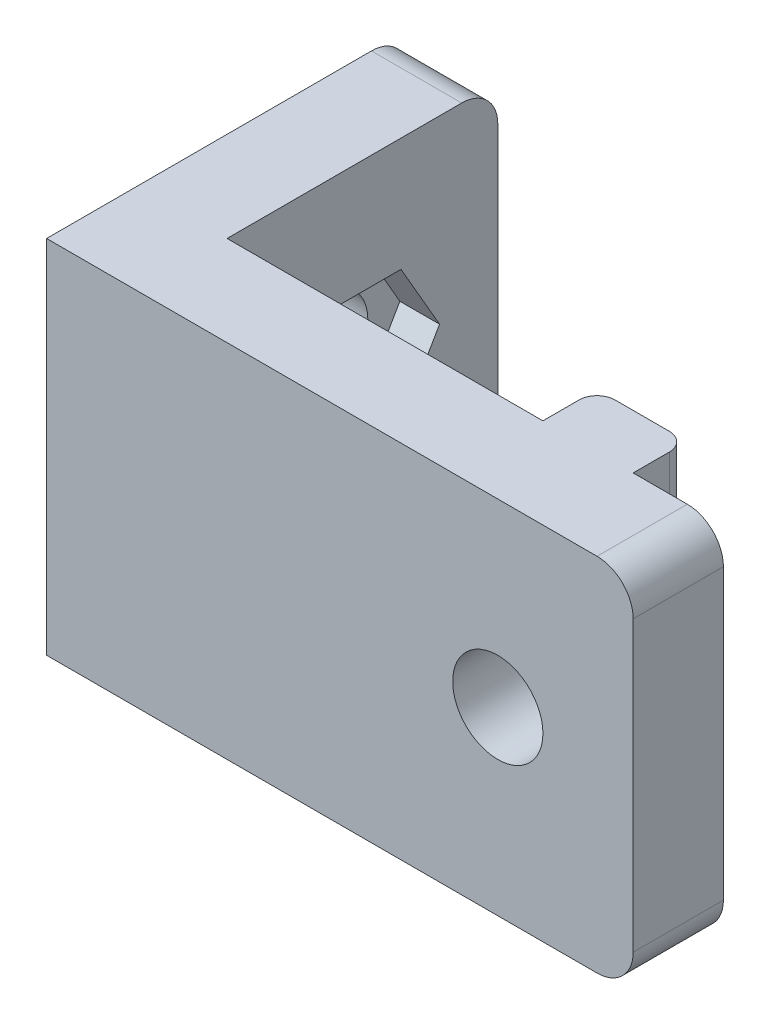
ISO-10303-21;
HEADER;
FILE_DESCRIPTION(('STEP AP214'),'2;1');
FILE_NAME('part.step','',(''),(''),'','','');
FILE_SCHEMA(('AUTOMOTIVE_DESIGN { 1 0 10303 214 1 1 1 1 }'));
ENDSEC;
DATA;
#1=APPLICATION_CONTEXT('core data for automotive mechanical design processes');
#2=APPLICATION_PROTOCOL_DEFINITION('international standard','automotive_design',2000,#1);
#3=PRODUCT_CONTEXT('',#1,'mechanical');
#4=PRODUCT('Part','Part','',(#3));
#5=PRODUCT_RELATED_PRODUCT_CATEGORY('part','',(#4));
#6=PRODUCT_DEFINITION_FORMATION('','',#4);
#7=PRODUCT_DEFINITION_CONTEXT('part definition',#1,'design');
#8=PRODUCT_DEFINITION('design','',#6,#7);
#9=PRODUCT_DEFINITION_SHAPE('','',#8);
#10=(LENGTH_UNIT() NAMED_UNIT(*) SI_UNIT(.MILLI.,.METRE.));
#11=(NAMED_UNIT(*) PLANE_ANGLE_UNIT() SI_UNIT($,.RADIAN.));
#12=(NAMED_UNIT(*) SI_UNIT($,.STERADIAN.) SOLID_ANGLE_UNIT());
#13=UNCERTAINTY_MEASURE_WITH_UNIT(LENGTH_MEASURE(1.E-05),#10,'distance_accuracy_value','');
#14=(GEOMETRIC_REPRESENTATION_CONTEXT(3) GLOBAL_UNCERTAINTY_ASSIGNED_CONTEXT((#13)) GLOBAL_UNIT_ASSIGNED_CONTEXT((#10,
#11,#12)) REPRESENTATION_CONTEXT('',''));
#15=CARTESIAN_POINT('',(0.,0.,0.));
#16=DIRECTION('',(0.,0.,1.));
#17=DIRECTION('',(1.,0.,0.));
#18=AXIS2_PLACEMENT_3D('',#15,#16,#17);
#19=CARTESIAN_POINT('',(-26.25,0.,-7.5));
#20=DIRECTION('',(1.,0.,0.));
#21=DIRECTION('',(0.,1.,0.));
#22=AXIS2_PLACEMENT_3D('',#19,#20,#21);
#23=CYLINDRICAL_SURFACE('',#22,2.5);
#24=CARTESIAN_POINT('',(-16.25,0.,-7.5));
#25=DIRECTION('',(1.,0.,0.));
#26=DIRECTION('',(0.,0.,-1.));
#27=AXIS2_PLACEMENT_3D('',#24,#25,#26);
#28=CIRCLE('',#27,2.5);
#29=CARTESIAN_POINT('',(-16.25,0.,-10.));
#30=VERTEX_POINT('',#29);
#31=EDGE_CURVE('E328',#30,#30,#28,.T.);
#32=ORIENTED_EDGE('',*,*,#31,.F.);
#33=EDGE_LOOP('',(#32));
#34=FACE_BOUND('',#33,.T.);
#35=CARTESIAN_POINT('',(-13.45,0.,-7.5));
#36=DIRECTION('',(1.,0.,0.));
#37=DIRECTION('',(0.,0.,-1.));
#38=AXIS2_PLACEMENT_3D('',#35,#36,#37);
#39=CIRCLE('',#38,2.5);
#40=CARTESIAN_POINT('',(-13.45,0.,-10.));
#41=VERTEX_POINT('',#40);
#42=EDGE_CURVE('E37',#41,#41,#39,.F.);
#43=ORIENTED_EDGE('',*,*,#42,.F.);
#44=EDGE_LOOP('',(#43));
#45=FACE_BOUND('',#44,.T.);
#46=ADVANCED_FACE('F33',(#34,#45),#23,.F.);
#47=CARTESIAN_POINT('',(0.,0.,0.));
#48=DIRECTION('',(0.,0.,1.));
#49=DIRECTION('',(1.,0.,0.));
#50=AXIS2_PLACEMENT_3D('',#47,#48,#49);
#51=PLANE('',#50);
#52=CARTESIAN_POINT('',(8.75,0.,0.));
#53=DIRECTION('',(0.,0.,1.));
#54=DIRECTION('',(1.,0.,0.));
#55=AXIS2_PLACEMENT_3D('',#52,#53,#54);
#56=CIRCLE('',#55,2.5);
#57=CARTESIAN_POINT('',(11.25,0.,0.));
#58=VERTEX_POINT('',#57);
#59=EDGE_CURVE('E325',#58,#58,#56,.T.);
#60=ORIENTED_EDGE('',*,*,#59,.T.);
#61=EDGE_LOOP('',(#60));
#62=FACE_BOUND('',#61,.T.);
#63=DIRECTION('',(-1.,0.,0.));
#64=VECTOR('',#63,1.);
#65=CARTESIAN_POINT('',(16.25,10.,0.));
#66=LINE('',#65,#64);
#67=CARTESIAN_POINT('',(14.25,10.,0.));
#68=VERTEX_POINT('',#67);
#69=CARTESIAN_POINT('',(11.25,10.,0.));
#70=VERTEX_POINT('',#69);
#71=EDGE_CURVE('E348',#68,#70,#66,.T.);
#72=ORIENTED_EDGE('',*,*,#71,.F.);
#73=CARTESIAN_POINT('',(14.25,8.,0.));
#74=DIRECTION('',(0.,0.,1.));
#75=DIRECTION('',(1.,0.,0.));
#76=AXIS2_PLACEMENT_3D('',#73,#74,#75);
#77=CIRCLE('',#76,2.);
#78=CARTESIAN_POINT('',(16.25,8.,0.));
#79=VERTEX_POINT('',#78);
#80=EDGE_CURVE('E413',#68,#79,#77,.F.);
#81=ORIENTED_EDGE('',*,*,#80,.T.);
#82=DIRECTION('',(0.,1.,0.));
#83=VECTOR('',#82,1.);
#84=CARTESIAN_POINT('',(16.25,-10.,0.));
#85=LINE('',#84,#83);
#86=CARTESIAN_POINT('',(16.25,-8.,0.));
#87=VERTEX_POINT('',#86);
#88=EDGE_CURVE('E360',#87,#79,#85,.T.);
#89=ORIENTED_EDGE('',*,*,#88,.F.);
#90=CARTESIAN_POINT('',(14.25,-8.,0.));
#91=DIRECTION('',(0.,0.,1.));
#92=DIRECTION('',(1.,0.,0.));
#93=AXIS2_PLACEMENT_3D('',#90,#91,#92);
#94=CIRCLE('',#93,2.);
#95=CARTESIAN_POINT('',(14.25,-10.,0.));
#96=VERTEX_POINT('',#95);
#97=EDGE_CURVE('E411',#87,#96,#94,.F.);
#98=ORIENTED_EDGE('',*,*,#97,.T.);
#99=DIRECTION('',(1.,0.,0.));
#100=VECTOR('',#99,1.);
#101=CARTESIAN_POINT('',(16.25,-10.,0.));
#102=LINE('',#101,#100);
#103=CARTESIAN_POINT('',(11.25,-10.,0.));
#104=VERTEX_POINT('',#103);
#105=EDGE_CURVE('E343',#104,#96,#102,.T.);
#106=ORIENTED_EDGE('',*,*,#105,.F.);
#107=DIRECTION('',(0.,-1.,0.));
#108=VECTOR('',#107,1.);
#109=CARTESIAN_POINT('',(11.25,-10.,0.));
#110=LINE('',#109,#108);
#111=CARTESIAN_POINT('',(11.25,-6.,0.));
#112=VERTEX_POINT('',#111);
#113=EDGE_CURVE('E279',#112,#104,#110,.T.);
#114=ORIENTED_EDGE('',*,*,#113,.F.);
#115=DIRECTION('',(1.,0.,0.));
#116=VECTOR('',#115,1.);
#117=CARTESIAN_POINT('',(11.25,-6.,0.));
#118=LINE('',#117,#116);
#119=CARTESIAN_POINT('',(6.24999999999999,-6.,0.));
#120=VERTEX_POINT('',#119);
#121=EDGE_CURVE('E286',#120,#112,#118,.T.);
#122=ORIENTED_EDGE('',*,*,#121,.F.);
#123=DIRECTION('',(0.,1.,0.));
#124=VECTOR('',#123,1.);
#125=CARTESIAN_POINT('',(6.24999999999999,-10.,0.));
#126=LINE('',#125,#124);
#127=CARTESIAN_POINT('',(6.24999999999999,-10.,0.));
#128=VERTEX_POINT('',#127);
#129=EDGE_CURVE('E283',#128,#120,#126,.T.);
#130=ORIENTED_EDGE('',*,*,#129,.F.);
#131=CARTESIAN_POINT('',(-11.25,-10.,0.));
#132=VERTEX_POINT('',#131);
#133=EDGE_CURVE('E357',#132,#128,#102,.T.);
#134=ORIENTED_EDGE('',*,*,#133,.F.);
#135=DIRECTION('',(0.,-1.,0.));
#136=VECTOR('',#135,1.);
#137=CARTESIAN_POINT('',(-11.25,10.,0.));
#138=LINE('',#137,#136);
#139=CARTESIAN_POINT('',(-11.25,10.,0.));
#140=VERTEX_POINT('',#139);
#141=EDGE_CURVE('E331',#140,#132,#138,.T.);
#142=ORIENTED_EDGE('',*,*,#141,.F.);
#143=CARTESIAN_POINT('',(6.25,10.,0.));
#144=VERTEX_POINT('',#143);
#145=EDGE_CURVE('E363',#144,#140,#66,.T.);
#146=ORIENTED_EDGE('',*,*,#145,.F.);
#147=DIRECTION('',(0.,1.,0.));
#148=VECTOR('',#147,1.);
#149=CARTESIAN_POINT('',(6.25,10.,0.));
#150=LINE('',#149,#148);
#151=CARTESIAN_POINT('',(6.25,6.,0.));
#152=VERTEX_POINT('',#151);
#153=EDGE_CURVE('E303',#152,#144,#150,.T.);
#154=ORIENTED_EDGE('',*,*,#153,.F.);
#155=DIRECTION('',(-1.,0.,0.));
#156=VECTOR('',#155,1.);
#157=CARTESIAN_POINT('',(11.25,6.,0.));
#158=LINE('',#157,#156);
#159=CARTESIAN_POINT('',(11.25,6.,0.));
#160=VERTEX_POINT('',#159);
#161=EDGE_CURVE('E309',#160,#152,#158,.T.);
#162=ORIENTED_EDGE('',*,*,#161,.F.);
#163=DIRECTION('',(0.,-1.,0.));
#164=VECTOR('',#163,1.);
#165=CARTESIAN_POINT('',(11.25,10.,0.));
#166=LINE('',#165,#164);
#167=EDGE_CURVE('E298',#70,#160,#166,.T.);
#168=ORIENTED_EDGE('',*,*,#167,.F.);
#169=EDGE_LOOP('',(#72,#81,#89,#98,#106,#114,#122,#130,#134,#142,#146,#154,#162,#168));
#170=FACE_BOUND('',#169,.T.);
#171=ADVANCED_FACE('F473',(#62,#170),#51,.F.);
#172=CARTESIAN_POINT('',(-16.25,-10.,5.));
#173=DIRECTION('',(1.,0.,0.));
#174=DIRECTION('',(0.,0.,-1.));
#175=AXIS2_PLACEMENT_3D('',#172,#173,#174);
#176=PLANE('',#175);
#177=ORIENTED_EDGE('',*,*,#31,.T.);
#178=EDGE_LOOP('',(#177));
#179=FACE_BOUND('',#178,.T.);
#180=DIRECTION('',(0.,0.,-1.));
#181=VECTOR('',#180,1.);
#182=CARTESIAN_POINT('',(-16.25,10.,5.));
#183=LINE('',#182,#181);
#184=CARTESIAN_POINT('',(-16.25,10.,5.));
#185=VERTEX_POINT('',#184);
#186=CARTESIAN_POINT('',(-16.25,10.,-13.));
#187=VERTEX_POINT('',#186);
#188=EDGE_CURVE('E356',#185,#187,#183,.T.);
#189=ORIENTED_EDGE('',*,*,#188,.T.);
#190=CARTESIAN_POINT('',(-16.25,8.,-13.));
#191=DIRECTION('',(1.,0.,0.));
#192=DIRECTION('',(0.,0.,-1.));
#193=AXIS2_PLACEMENT_3D('',#190,#191,#192);
#194=CIRCLE('',#193,2.);
#195=CARTESIAN_POINT('',(-16.25,8.,-15.));
#196=VERTEX_POINT('',#195);
#197=EDGE_CURVE('E11',#187,#196,#194,.F.);
#198=ORIENTED_EDGE('',*,*,#197,.T.);
#199=DIRECTION('',(0.,1.,0.));
#200=VECTOR('',#199,1.);
#201=CARTESIAN_POINT('',(-16.25,10.,-15.));
#202=LINE('',#201,#200);
#203=CARTESIAN_POINT('',(-16.25,-8.,-15.));
#204=VERTEX_POINT('',#203);
#205=EDGE_CURVE('E332',#204,#196,#202,.T.);
#206=ORIENTED_EDGE('',*,*,#205,.F.);
#207=CARTESIAN_POINT('',(-16.25,-8.,-13.));
#208=DIRECTION('',(1.,0.,0.));
#209=DIRECTION('',(0.,0.,-1.));
#210=AXIS2_PLACEMENT_3D('',#207,#208,#209);
#211=CIRCLE('',#210,2.);
#212=CARTESIAN_POINT('',(-16.25,-10.,-13.));
#213=VERTEX_POINT('',#212);
#214=EDGE_CURVE('E42',#204,#213,#211,.F.);
#215=ORIENTED_EDGE('',*,*,#214,.T.);
#216=DIRECTION('',(0.,0.,-1.));
#217=VECTOR('',#216,1.);
#218=CARTESIAN_POINT('',(-16.25,-10.,5.));
#219=LINE('',#218,#217);
#220=CARTESIAN_POINT('',(-16.25,-10.,5.));
#221=VERTEX_POINT('',#220);
#222=EDGE_CURVE('E367',#221,#213,#219,.T.);
#223=ORIENTED_EDGE('',*,*,#222,.F.);
#224=DIRECTION('',(0.,-1.,0.));
#225=VECTOR('',#224,1.);
#226=CARTESIAN_POINT('',(-16.25,-10.,5.));
#227=LINE('',#226,#225);
#228=EDGE_CURVE('E344',#185,#221,#227,.T.);
#229=ORIENTED_EDGE('',*,*,#228,.F.);
#230=EDGE_LOOP('',(#189,#198,#206,#215,#223,#229));
#231=FACE_BOUND('',#230,.T.);
#232=ADVANCED_FACE('F440',(#179,#231),#176,.F.);
#233=CARTESIAN_POINT('',(16.25,-10.,5.));
#234=DIRECTION('',(0.,1.,0.));
#235=DIRECTION('',(-1.,0.,0.));
#236=AXIS2_PLACEMENT_3D('',#233,#234,#235);
#237=PLANE('',#236);
#238=ORIENTED_EDGE('',*,*,#105,.T.);
#239=DIRECTION('',(0.,0.,-1.));
#240=VECTOR('',#239,1.);
#241=CARTESIAN_POINT('',(14.25,-10.,5.));
#242=LINE('',#241,#240);
#243=CARTESIAN_POINT('',(14.25,-10.,5.));
#244=VERTEX_POINT('',#243);
#245=EDGE_CURVE('E426',#96,#244,#242,.F.);
#246=ORIENTED_EDGE('',*,*,#245,.T.);
#247=DIRECTION('',(1.,0.,0.));
#248=VECTOR('',#247,1.);
#249=CARTESIAN_POINT('',(16.25,-10.,5.));
#250=LINE('',#249,#248);
#251=EDGE_CURVE('E347',#221,#244,#250,.T.);
#252=ORIENTED_EDGE('',*,*,#251,.F.);
#253=ORIENTED_EDGE('',*,*,#222,.T.);
#254=DIRECTION('',(-1.,0.,0.));
#255=VECTOR('',#254,1.);
#256=CARTESIAN_POINT('',(16.25,-10.,-13.));
#257=LINE('',#256,#255);
#258=CARTESIAN_POINT('',(-11.25,-10.,-13.));
#259=VERTEX_POINT('',#258);
#260=EDGE_CURVE('E424',#213,#259,#257,.F.);
#261=ORIENTED_EDGE('',*,*,#260,.T.);
#262=DIRECTION('',(0.,0.,1.));
#263=VECTOR('',#262,1.);
#264=CARTESIAN_POINT('',(-11.25,-10.,-15.));
#265=LINE('',#264,#263);
#266=EDGE_CURVE('E337',#259,#132,#265,.T.);
#267=ORIENTED_EDGE('',*,*,#266,.T.);
#268=ORIENTED_EDGE('',*,*,#133,.T.);
#269=DIRECTION('',(0.,0.,1.));
#270=VECTOR('',#269,1.);
#271=CARTESIAN_POINT('',(6.24999999999999,-10.,-3.));
#272=LINE('',#271,#270);
#273=CARTESIAN_POINT('',(6.24999999999999,-10.,-2.));
#274=VERTEX_POINT('',#273);
#275=EDGE_CURVE('E296',#274,#128,#272,.T.);
#276=ORIENTED_EDGE('',*,*,#275,.F.);
#277=CARTESIAN_POINT('',(7.24999999999999,-10.,-2.));
#278=DIRECTION('',(0.,1.,0.));
#279=DIRECTION('',(-1.,0.,0.));
#280=AXIS2_PLACEMENT_3D('',#277,#278,#279);
#281=CIRCLE('',#280,1.);
#282=CARTESIAN_POINT('',(7.24999999999999,-10.,-3.));
#283=VERTEX_POINT('',#282);
#284=EDGE_CURVE('E384',#274,#283,#281,.F.);
#285=ORIENTED_EDGE('',*,*,#284,.T.);
#286=DIRECTION('',(-1.,0.,0.));
#287=VECTOR('',#286,1.);
#288=CARTESIAN_POINT('',(11.25,-10.,-3.));
#289=LINE('',#288,#287);
#290=CARTESIAN_POINT('',(10.25,-10.,-3.));
#291=VERTEX_POINT('',#290);
#292=EDGE_CURVE('E275',#291,#283,#289,.T.);
#293=ORIENTED_EDGE('',*,*,#292,.F.);
#294=CARTESIAN_POINT('',(10.25,-10.,-2.));
#295=DIRECTION('',(0.,1.,0.));
#296=DIRECTION('',(-1.,0.,0.));
#297=AXIS2_PLACEMENT_3D('',#294,#295,#296);
#298=CIRCLE('',#297,1.);
#299=CARTESIAN_POINT('',(11.25,-10.,-2.));
#300=VERTEX_POINT('',#299);
#301=EDGE_CURVE('E382',#291,#300,#298,.F.);
#302=ORIENTED_EDGE('',*,*,#301,.T.);
#303=DIRECTION('',(0.,0.,1.));
#304=VECTOR('',#303,1.);
#305=CARTESIAN_POINT('',(11.25,-10.,-3.));
#306=LINE('',#305,#304);
#307=EDGE_CURVE('E282',#300,#104,#306,.T.);
#308=ORIENTED_EDGE('',*,*,#307,.T.);
#309=EDGE_LOOP('',(#238,#246,#252,#253,#261,#267,#268,#276,#285,#293,#302,#308));
#310=FACE_BOUND('',#309,.T.);
#311=ADVANCED_FACE('F447',(#310),#237,.F.);
#312=CARTESIAN_POINT('',(16.25,-10.,5.));
#313=DIRECTION('',(-1.,0.,0.));
#314=DIRECTION('',(0.,0.,1.));
#315=AXIS2_PLACEMENT_3D('',#312,#313,#314);
#316=PLANE('',#315);
#317=ORIENTED_EDGE('',*,*,#88,.T.);
#318=DIRECTION('',(0.,0.,-1.));
#319=VECTOR('',#318,1.);
#320=CARTESIAN_POINT('',(16.25,8.,5.));
#321=LINE('',#320,#319);
#322=CARTESIAN_POINT('',(16.25,8.,5.));
#323=VERTEX_POINT('',#322);
#324=EDGE_CURVE('E418',#79,#323,#321,.F.);
#325=ORIENTED_EDGE('',*,*,#324,.T.);
#326=DIRECTION('',(0.,1.,0.));
#327=VECTOR('',#326,1.);
#328=CARTESIAN_POINT('',(16.25,-10.,5.));
#329=LINE('',#328,#327);
#330=CARTESIAN_POINT('',(16.25,-8.,5.));
#331=VERTEX_POINT('',#330);
#332=EDGE_CURVE('E351',#331,#323,#329,.T.);
#333=ORIENTED_EDGE('',*,*,#332,.F.);
#334=DIRECTION('',(0.,0.,-1.));
#335=VECTOR('',#334,1.);
#336=CARTESIAN_POINT('',(16.25,-8.,5.));
#337=LINE('',#336,#335);
#338=EDGE_CURVE('E415',#331,#87,#337,.T.);
#339=ORIENTED_EDGE('',*,*,#338,.T.);
#340=EDGE_LOOP('',(#317,#325,#333,#339));
#341=FACE_BOUND('',#340,.T.);
#342=ADVANCED_FACE('F476',(#341),#316,.F.);
#343=CARTESIAN_POINT('',(16.25,10.,5.));
#344=DIRECTION('',(0.,-1.,0.));
#345=DIRECTION('',(0.,0.,-1.));
#346=AXIS2_PLACEMENT_3D('',#343,#344,#345);
#347=PLANE('',#346);
#348=DIRECTION('',(-1.,0.,0.));
#349=VECTOR('',#348,1.);
#350=CARTESIAN_POINT('',(16.25,10.,5.));
#351=LINE('',#350,#349);
#352=CARTESIAN_POINT('',(14.25,10.,5.));
#353=VERTEX_POINT('',#352);
#354=EDGE_CURVE('E354',#353,#185,#351,.T.);
#355=ORIENTED_EDGE('',*,*,#354,.F.);
#356=DIRECTION('',(0.,0.,-1.));
#357=VECTOR('',#356,1.);
#358=CARTESIAN_POINT('',(14.25,10.,5.));
#359=LINE('',#358,#357);
#360=EDGE_CURVE('E408',#353,#68,#359,.T.);
#361=ORIENTED_EDGE('',*,*,#360,.T.);
#362=ORIENTED_EDGE('',*,*,#71,.T.);
#363=DIRECTION('',(0.,0.,1.));
#364=VECTOR('',#363,1.);
#365=CARTESIAN_POINT('',(11.25,10.,-3.));
#366=LINE('',#365,#364);
#367=CARTESIAN_POINT('',(11.25,10.,-2.));
#368=VERTEX_POINT('',#367);
#369=EDGE_CURVE('E306',#368,#70,#366,.T.);
#370=ORIENTED_EDGE('',*,*,#369,.F.);
#371=CARTESIAN_POINT('',(10.25,10.,-2.));
#372=DIRECTION('',(0.,-1.,0.));
#373=DIRECTION('',(0.,0.,-1.));
#374=AXIS2_PLACEMENT_3D('',#371,#372,#373);
#375=CIRCLE('',#374,1.);
#376=CARTESIAN_POINT('',(10.25,10.,-3.));
#377=VERTEX_POINT('',#376);
#378=EDGE_CURVE('E394',#368,#377,#375,.F.);
#379=ORIENTED_EDGE('',*,*,#378,.T.);
#380=DIRECTION('',(1.,0.,0.));
#381=VECTOR('',#380,1.);
#382=CARTESIAN_POINT('',(11.25,10.,-3.));
#383=LINE('',#382,#381);
#384=CARTESIAN_POINT('',(7.25,10.,-3.));
#385=VERTEX_POINT('',#384);
#386=EDGE_CURVE('E302',#385,#377,#383,.T.);
#387=ORIENTED_EDGE('',*,*,#386,.F.);
#388=CARTESIAN_POINT('',(7.25,10.,-2.));
#389=DIRECTION('',(0.,-1.,0.));
#390=DIRECTION('',(0.,0.,-1.));
#391=AXIS2_PLACEMENT_3D('',#388,#389,#390);
#392=CIRCLE('',#391,1.);
#393=CARTESIAN_POINT('',(6.25,10.,-2.));
#394=VERTEX_POINT('',#393);
#395=EDGE_CURVE('E396',#385,#394,#392,.F.);
#396=ORIENTED_EDGE('',*,*,#395,.T.);
#397=DIRECTION('',(0.,0.,1.));
#398=VECTOR('',#397,1.);
#399=CARTESIAN_POINT('',(6.25,10.,-3.));
#400=LINE('',#399,#398);
#401=EDGE_CURVE('E316',#394,#144,#400,.T.);
#402=ORIENTED_EDGE('',*,*,#401,.T.);
#403=ORIENTED_EDGE('',*,*,#145,.T.);
#404=DIRECTION('',(0.,0.,1.));
#405=VECTOR('',#404,1.);
#406=CARTESIAN_POINT('',(-11.25,10.,-15.));
#407=LINE('',#406,#405);
#408=CARTESIAN_POINT('',(-11.25,10.,-13.));
#409=VERTEX_POINT('',#408);
#410=EDGE_CURVE('E341',#409,#140,#407,.T.);
#411=ORIENTED_EDGE('',*,*,#410,.F.);
#412=DIRECTION('',(1.,0.,0.));
#413=VECTOR('',#412,1.);
#414=CARTESIAN_POINT('',(16.25,10.,-13.));
#415=LINE('',#414,#413);
#416=EDGE_CURVE('E406',#409,#187,#415,.F.);
#417=ORIENTED_EDGE('',*,*,#416,.T.);
#418=ORIENTED_EDGE('',*,*,#188,.F.);
#419=EDGE_LOOP('',(#355,#361,#362,#370,#379,#387,#396,#402,#403,#411,#417,#418));
#420=FACE_BOUND('',#419,.T.);
#421=ADVANCED_FACE('F458',(#420),#347,.F.);
#422=CARTESIAN_POINT('',(0.,0.,5.));
#423=DIRECTION('',(0.,0.,1.));
#424=DIRECTION('',(1.,0.,0.));
#425=AXIS2_PLACEMENT_3D('',#422,#423,#424);
#426=PLANE('',#425);
#427=CARTESIAN_POINT('',(8.75,0.,5.));
#428=DIRECTION('',(0.,0.,1.));
#429=DIRECTION('',(1.,0.,0.));
#430=AXIS2_PLACEMENT_3D('',#427,#428,#429);
#431=CIRCLE('',#430,2.5);
#432=CARTESIAN_POINT('',(11.25,0.,5.));
#433=VERTEX_POINT('',#432);
#434=EDGE_CURVE('E322',#433,#433,#431,.T.);
#435=ORIENTED_EDGE('',*,*,#434,.F.);
#436=EDGE_LOOP('',(#435));
#437=FACE_BOUND('',#436,.T.);
#438=ORIENTED_EDGE('',*,*,#332,.T.);
#439=CARTESIAN_POINT('',(14.25,8.,5.));
#440=DIRECTION('',(0.,0.,1.));
#441=DIRECTION('',(1.,0.,0.));
#442=AXIS2_PLACEMENT_3D('',#439,#440,#441);
#443=CIRCLE('',#442,2.);
#444=EDGE_CURVE('E422',#323,#353,#443,.T.);
#445=ORIENTED_EDGE('',*,*,#444,.T.);
#446=ORIENTED_EDGE('',*,*,#354,.T.);
#447=ORIENTED_EDGE('',*,*,#228,.T.);
#448=ORIENTED_EDGE('',*,*,#251,.T.);
#449=CARTESIAN_POINT('',(14.25,-8.,5.));
#450=DIRECTION('',(0.,0.,1.));
#451=DIRECTION('',(1.,0.,0.));
#452=AXIS2_PLACEMENT_3D('',#449,#450,#451);
#453=CIRCLE('',#452,2.);
#454=EDGE_CURVE('E420',#244,#331,#453,.T.);
#455=ORIENTED_EDGE('',*,*,#454,.T.);
#456=EDGE_LOOP('',(#438,#445,#446,#447,#448,#455));
#457=FACE_BOUND('',#456,.T.);
#458=ADVANCED_FACE('F541',(#437,#457),#426,.T.);
#459=CARTESIAN_POINT('',(-11.25,10.,-15.));
#460=DIRECTION('',(-1.,0.,0.));
#461=DIRECTION('',(0.,-1.,0.));
#462=AXIS2_PLACEMENT_3D('',#459,#460,#461);
#463=PLANE('',#462);
#464=DIRECTION('',(0.,-0.866025403784439,-0.5));
#465=VECTOR('',#464,1.);
#466=CARTESIAN_POINT('',(-11.25,0.,-3.22760800799677));
#467=LINE('',#466,#465);
#468=CARTESIAN_POINT('',(-11.25,0.,-3.22760800799677));
#469=VERTEX_POINT('',#468);
#470=CARTESIAN_POINT('',(-11.25,-3.7,-5.36380400399838));
#471=VERTEX_POINT('',#470);
#472=EDGE_CURVE('E256',#469,#471,#467,.T.);
#473=ORIENTED_EDGE('',*,*,#472,.F.);
#474=DIRECTION('',(0.,-0.866025403784439,0.5));
#475=VECTOR('',#474,1.);
#476=CARTESIAN_POINT('',(-11.25,3.7,-5.36380400399838));
#477=LINE('',#476,#475);
#478=CARTESIAN_POINT('',(-11.25,3.7,-5.36380400399838));
#479=VERTEX_POINT('',#478);
#480=EDGE_CURVE('E49',#479,#469,#477,.T.);
#481=ORIENTED_EDGE('',*,*,#480,.F.);
#482=DIRECTION('',(0.,0.,1.));
#483=VECTOR('',#482,1.);
#484=CARTESIAN_POINT('',(-11.25,3.7,-9.63619599600161));
#485=LINE('',#484,#483);
#486=CARTESIAN_POINT('',(-11.25,3.7,-9.63619599600161));
#487=VERTEX_POINT('',#486);
#488=EDGE_CURVE('E242',#487,#479,#485,.T.);
#489=ORIENTED_EDGE('',*,*,#488,.F.);
#490=DIRECTION('',(0.,0.866025403784439,0.5));
#491=VECTOR('',#490,1.);
#492=CARTESIAN_POINT('',(-11.25,0.,-11.7723919920032));
#493=LINE('',#492,#491);
#494=CARTESIAN_POINT('',(-11.25,0.,-11.7723919920032));
#495=VERTEX_POINT('',#494);
#496=EDGE_CURVE('E245',#495,#487,#493,.T.);
#497=ORIENTED_EDGE('',*,*,#496,.F.);
#498=DIRECTION('',(0.,0.866025403784439,-0.5));
#499=VECTOR('',#498,1.);
#500=CARTESIAN_POINT('',(-11.25,-3.7,-9.63619599600161));
#501=LINE('',#500,#499);
#502=CARTESIAN_POINT('',(-11.25,-3.7,-9.63619599600161));
#503=VERTEX_POINT('',#502);
#504=EDGE_CURVE('E261',#503,#495,#501,.T.);
#505=ORIENTED_EDGE('',*,*,#504,.F.);
#506=DIRECTION('',(0.,0.,-1.));
#507=VECTOR('',#506,1.);
#508=CARTESIAN_POINT('',(-11.25,-3.7,-5.36380400399838));
#509=LINE('',#508,#507);
#510=EDGE_CURVE('E258',#471,#503,#509,.T.);
#511=ORIENTED_EDGE('',*,*,#510,.F.);
#512=EDGE_LOOP('',(#473,#481,#489,#497,#505,#511));
#513=FACE_BOUND('',#512,.T.);
#514=DIRECTION('',(0.,-1.,0.));
#515=VECTOR('',#514,1.);
#516=CARTESIAN_POINT('',(-11.25,10.,-15.));
#517=LINE('',#516,#515);
#518=CARTESIAN_POINT('',(-11.25,8.,-15.));
#519=VERTEX_POINT('',#518);
#520=CARTESIAN_POINT('',(-11.25,-8.,-15.));
#521=VERTEX_POINT('',#520);
#522=EDGE_CURVE('E335',#519,#521,#517,.T.);
#523=ORIENTED_EDGE('',*,*,#522,.F.);
#524=CARTESIAN_POINT('',(-11.25,8.,-13.));
#525=DIRECTION('',(-1.,0.,0.));
#526=DIRECTION('',(0.,-1.,0.));
#527=AXIS2_PLACEMENT_3D('',#524,#525,#526);
#528=CIRCLE('',#527,2.);
#529=EDGE_CURVE('E435',#519,#409,#528,.F.);
#530=ORIENTED_EDGE('',*,*,#529,.T.);
#531=ORIENTED_EDGE('',*,*,#410,.T.);
#532=ORIENTED_EDGE('',*,*,#141,.T.);
#533=ORIENTED_EDGE('',*,*,#266,.F.);
#534=CARTESIAN_POINT('',(-11.25,-8.,-13.));
#535=DIRECTION('',(-1.,0.,0.));
#536=DIRECTION('',(0.,-1.,0.));
#537=AXIS2_PLACEMENT_3D('',#534,#535,#536);
#538=CIRCLE('',#537,2.);
#539=EDGE_CURVE('E57',#259,#521,#538,.F.);
#540=ORIENTED_EDGE('',*,*,#539,.T.);
#541=EDGE_LOOP('',(#523,#530,#531,#532,#533,#540));
#542=FACE_BOUND('',#541,.T.);
#543=ADVANCED_FACE('F451',(#513,#542),#463,.F.);
#544=CARTESIAN_POINT('',(0.,0.,-15.));
#545=DIRECTION('',(0.,0.,1.));
#546=DIRECTION('',(1.,0.,0.));
#547=AXIS2_PLACEMENT_3D('',#544,#545,#546);
#548=PLANE('',#547);
#549=ORIENTED_EDGE('',*,*,#205,.T.);
#550=DIRECTION('',(1.,0.,0.));
#551=VECTOR('',#550,1.);
#552=CARTESIAN_POINT('',(0.,8.,-15.));
#553=LINE('',#552,#551);
#554=EDGE_CURVE('E431',#196,#519,#553,.T.);
#555=ORIENTED_EDGE('',*,*,#554,.T.);
#556=ORIENTED_EDGE('',*,*,#522,.T.);
#557=DIRECTION('',(-1.,0.,0.));
#558=VECTOR('',#557,1.);
#559=CARTESIAN_POINT('',(0.,-8.,-15.));
#560=LINE('',#559,#558);
#561=EDGE_CURVE('E428',#521,#204,#560,.T.);
#562=ORIENTED_EDGE('',*,*,#561,.T.);
#563=EDGE_LOOP('',(#549,#555,#556,#562));
#564=FACE_BOUND('',#563,.T.);
#565=ADVANCED_FACE('F449',(#564),#548,.F.);
#566=CARTESIAN_POINT('',(8.75,0.,-10.));
#567=DIRECTION('',(0.,0.,1.));
#568=DIRECTION('',(1.,0.,0.));
#569=AXIS2_PLACEMENT_3D('',#566,#567,#568);
#570=CYLINDRICAL_SURFACE('',#569,2.5);
#571=ORIENTED_EDGE('',*,*,#434,.T.);
#572=EDGE_LOOP('',(#571));
#573=FACE_BOUND('',#572,.T.);
#574=ORIENTED_EDGE('',*,*,#59,.F.);
#575=EDGE_LOOP('',(#574));
#576=FACE_BOUND('',#575,.T.);
#577=ADVANCED_FACE('F535',(#573,#576),#570,.F.);
#578=CARTESIAN_POINT('',(11.25,10.,-3.));
#579=DIRECTION('',(-1.,0.,0.));
#580=DIRECTION('',(0.,-1.,0.));
#581=AXIS2_PLACEMENT_3D('',#578,#579,#580);
#582=PLANE('',#581);
#583=DIRECTION('',(0.,0.,1.));
#584=VECTOR('',#583,1.);
#585=CARTESIAN_POINT('',(11.25,6.,-3.));
#586=LINE('',#585,#584);
#587=CARTESIAN_POINT('',(11.25,6.,-2.));
#588=VERTEX_POINT('',#587);
#589=EDGE_CURVE('E320',#588,#160,#586,.T.);
#590=ORIENTED_EDGE('',*,*,#589,.F.);
#591=DIRECTION('',(0.,-1.,0.));
#592=VECTOR('',#591,1.);
#593=CARTESIAN_POINT('',(11.25,10.,-2.));
#594=LINE('',#593,#592);
#595=EDGE_CURVE('E404',#588,#368,#594,.F.);
#596=ORIENTED_EDGE('',*,*,#595,.T.);
#597=ORIENTED_EDGE('',*,*,#369,.T.);
#598=ORIENTED_EDGE('',*,*,#167,.T.);
#599=EDGE_LOOP('',(#590,#596,#597,#598));
#600=FACE_BOUND('',#599,.T.);
#601=ADVANCED_FACE('F590',(#600),#582,.F.);
#602=CARTESIAN_POINT('',(11.25,6.,-3.));
#603=DIRECTION('',(0.,1.,0.));
#604=DIRECTION('',(0.,0.,1.));
#605=AXIS2_PLACEMENT_3D('',#602,#603,#604);
#606=PLANE('',#605);
#607=DIRECTION('',(0.,0.,1.));
#608=VECTOR('',#607,1.);
#609=CARTESIAN_POINT('',(6.25,6.,-3.));
#610=LINE('',#609,#608);
#611=CARTESIAN_POINT('',(6.25,6.,-2.));
#612=VERTEX_POINT('',#611);
#613=EDGE_CURVE('E318',#612,#152,#610,.T.);
#614=ORIENTED_EDGE('',*,*,#613,.F.);
#615=CARTESIAN_POINT('',(7.25,6.,-2.));
#616=DIRECTION('',(0.,1.,0.));
#617=DIRECTION('',(0.,0.,1.));
#618=AXIS2_PLACEMENT_3D('',#615,#616,#617);
#619=CIRCLE('',#618,1.);
#620=CARTESIAN_POINT('',(7.25,6.,-3.));
#621=VERTEX_POINT('',#620);
#622=EDGE_CURVE('E402',#612,#621,#619,.F.);
#623=ORIENTED_EDGE('',*,*,#622,.T.);
#624=DIRECTION('',(-1.,0.,0.));
#625=VECTOR('',#624,1.);
#626=CARTESIAN_POINT('',(11.25,6.,-3.));
#627=LINE('',#626,#625);
#628=CARTESIAN_POINT('',(10.25,6.,-3.));
#629=VERTEX_POINT('',#628);
#630=EDGE_CURVE('E299',#629,#621,#627,.T.);
#631=ORIENTED_EDGE('',*,*,#630,.F.);
#632=CARTESIAN_POINT('',(10.25,6.,-2.));
#633=DIRECTION('',(0.,1.,0.));
#634=DIRECTION('',(0.,0.,1.));
#635=AXIS2_PLACEMENT_3D('',#632,#633,#634);
#636=CIRCLE('',#635,1.);
#637=EDGE_CURVE('E400',#629,#588,#636,.F.);
#638=ORIENTED_EDGE('',*,*,#637,.T.);
#639=ORIENTED_EDGE('',*,*,#589,.T.);
#640=ORIENTED_EDGE('',*,*,#161,.T.);
#641=EDGE_LOOP('',(#614,#623,#631,#638,#639,#640));
#642=FACE_BOUND('',#641,.T.);
#643=ADVANCED_FACE('F597',(#642),#606,.F.);
#644=CARTESIAN_POINT('',(6.25,10.,-3.));
#645=DIRECTION('',(1.,0.,0.));
#646=DIRECTION('',(0.,1.,0.));
#647=AXIS2_PLACEMENT_3D('',#644,#645,#646);
#648=PLANE('',#647);
#649=ORIENTED_EDGE('',*,*,#401,.F.);
#650=DIRECTION('',(0.,1.,0.));
#651=VECTOR('',#650,1.);
#652=CARTESIAN_POINT('',(6.25,6.,-2.));
#653=LINE('',#652,#651);
#654=EDGE_CURVE('E398',#394,#612,#653,.F.);
#655=ORIENTED_EDGE('',*,*,#654,.T.);
#656=ORIENTED_EDGE('',*,*,#613,.T.);
#657=ORIENTED_EDGE('',*,*,#153,.T.);
#658=EDGE_LOOP('',(#649,#655,#656,#657));
#659=FACE_BOUND('',#658,.T.);
#660=ADVANCED_FACE('F604',(#659),#648,.F.);
#661=CARTESIAN_POINT('',(0.,0.,-3.));
#662=DIRECTION('',(0.,0.,-1.));
#663=DIRECTION('',(-1.,0.,0.));
#664=AXIS2_PLACEMENT_3D('',#661,#662,#663);
#665=PLANE('',#664);
#666=ORIENTED_EDGE('',*,*,#630,.T.);
#667=DIRECTION('',(0.,1.,0.));
#668=VECTOR('',#667,1.);
#669=CARTESIAN_POINT('',(7.25,10.,-3.));
#670=LINE('',#669,#668);
#671=EDGE_CURVE('E391',#621,#385,#670,.T.);
#672=ORIENTED_EDGE('',*,*,#671,.T.);
#673=ORIENTED_EDGE('',*,*,#386,.T.);
#674=DIRECTION('',(0.,-1.,0.));
#675=VECTOR('',#674,1.);
#676=CARTESIAN_POINT('',(10.25,6.,-3.));
#677=LINE('',#676,#675);
#678=EDGE_CURVE('E388',#377,#629,#677,.T.);
#679=ORIENTED_EDGE('',*,*,#678,.T.);
#680=EDGE_LOOP('',(#666,#672,#673,#679));
#681=FACE_BOUND('',#680,.T.);
#682=ADVANCED_FACE('F612',(#681),#665,.T.);
#683=CARTESIAN_POINT('',(6.24999999999999,-10.,-3.));
#684=DIRECTION('',(1.,0.,0.));
#685=DIRECTION('',(0.,1.,0.));
#686=AXIS2_PLACEMENT_3D('',#683,#684,#685);
#687=PLANE('',#686);
#688=DIRECTION('',(0.,0.,1.));
#689=VECTOR('',#688,1.);
#690=CARTESIAN_POINT('',(6.24999999999999,-6.,-3.));
#691=LINE('',#690,#689);
#692=CARTESIAN_POINT('',(6.24999999999999,-6.,-2.));
#693=VERTEX_POINT('',#692);
#694=EDGE_CURVE('E294',#693,#120,#691,.T.);
#695=ORIENTED_EDGE('',*,*,#694,.F.);
#696=DIRECTION('',(0.,1.,0.));
#697=VECTOR('',#696,1.);
#698=CARTESIAN_POINT('',(6.24999999999999,-10.,-2.));
#699=LINE('',#698,#697);
#700=EDGE_CURVE('E380',#693,#274,#699,.F.);
#701=ORIENTED_EDGE('',*,*,#700,.T.);
#702=ORIENTED_EDGE('',*,*,#275,.T.);
#703=ORIENTED_EDGE('',*,*,#129,.T.);
#704=EDGE_LOOP('',(#695,#701,#702,#703));
#705=FACE_BOUND('',#704,.T.);
#706=ADVANCED_FACE('F501',(#705),#687,.F.);
#707=CARTESIAN_POINT('',(11.25,-6.,-3.));
#708=DIRECTION('',(0.,-1.,0.));
#709=DIRECTION('',(0.,0.,-1.));
#710=AXIS2_PLACEMENT_3D('',#707,#708,#709);
#711=PLANE('',#710);
#712=DIRECTION('',(1.,0.,0.));
#713=VECTOR('',#712,1.);
#714=CARTESIAN_POINT('',(11.25,-6.,-3.));
#715=LINE('',#714,#713);
#716=CARTESIAN_POINT('',(7.24999999999999,-6.,-3.));
#717=VERTEX_POINT('',#716);
#718=CARTESIAN_POINT('',(10.25,-6.,-3.));
#719=VERTEX_POINT('',#718);
#720=EDGE_CURVE('E278',#717,#719,#715,.T.);
#721=ORIENTED_EDGE('',*,*,#720,.F.);
#722=CARTESIAN_POINT('',(7.24999999999999,-6.,-2.));
#723=DIRECTION('',(0.,-1.,0.));
#724=DIRECTION('',(0.,0.,-1.));
#725=AXIS2_PLACEMENT_3D('',#722,#723,#724);
#726=CIRCLE('',#725,1.);
#727=EDGE_CURVE('E378',#717,#693,#726,.F.);
#728=ORIENTED_EDGE('',*,*,#727,.T.);
#729=ORIENTED_EDGE('',*,*,#694,.T.);
#730=ORIENTED_EDGE('',*,*,#121,.T.);
#731=DIRECTION('',(0.,0.,1.));
#732=VECTOR('',#731,1.);
#733=CARTESIAN_POINT('',(11.25,-6.,-3.));
#734=LINE('',#733,#732);
#735=CARTESIAN_POINT('',(11.25,-6.,-2.));
#736=VERTEX_POINT('',#735);
#737=EDGE_CURVE('E292',#736,#112,#734,.T.);
#738=ORIENTED_EDGE('',*,*,#737,.F.);
#739=CARTESIAN_POINT('',(10.25,-6.,-2.));
#740=DIRECTION('',(0.,-1.,0.));
#741=DIRECTION('',(0.,0.,-1.));
#742=AXIS2_PLACEMENT_3D('',#739,#740,#741);
#743=CIRCLE('',#742,1.);
#744=EDGE_CURVE('E376',#736,#719,#743,.F.);
#745=ORIENTED_EDGE('',*,*,#744,.T.);
#746=EDGE_LOOP('',(#721,#728,#729,#730,#738,#745));
#747=FACE_BOUND('',#746,.T.);
#748=ADVANCED_FACE('F496',(#747),#711,.F.);
#749=CARTESIAN_POINT('',(11.25,-10.,-3.));
#750=DIRECTION('',(-1.,0.,0.));
#751=DIRECTION('',(0.,-1.,0.));
#752=AXIS2_PLACEMENT_3D('',#749,#750,#751);
#753=PLANE('',#752);
#754=ORIENTED_EDGE('',*,*,#307,.F.);
#755=DIRECTION('',(0.,-1.,0.));
#756=VECTOR('',#755,1.);
#757=CARTESIAN_POINT('',(11.25,-6.,-2.));
#758=LINE('',#757,#756);
#759=EDGE_CURVE('E386',#300,#736,#758,.F.);
#760=ORIENTED_EDGE('',*,*,#759,.T.);
#761=ORIENTED_EDGE('',*,*,#737,.T.);
#762=ORIENTED_EDGE('',*,*,#113,.T.);
#763=EDGE_LOOP('',(#754,#760,#761,#762));
#764=FACE_BOUND('',#763,.T.);
#765=ADVANCED_FACE('F489',(#764),#753,.F.);
#766=CARTESIAN_POINT('',(0.,0.,-3.));
#767=DIRECTION('',(0.,0.,-1.));
#768=DIRECTION('',(-1.,0.,0.));
#769=AXIS2_PLACEMENT_3D('',#766,#767,#768);
#770=PLANE('',#769);
#771=ORIENTED_EDGE('',*,*,#292,.T.);
#772=DIRECTION('',(0.,1.,0.));
#773=VECTOR('',#772,1.);
#774=CARTESIAN_POINT('',(7.24999999999999,-6.,-3.));
#775=LINE('',#774,#773);
#776=EDGE_CURVE('E373',#283,#717,#775,.T.);
#777=ORIENTED_EDGE('',*,*,#776,.T.);
#778=ORIENTED_EDGE('',*,*,#720,.T.);
#779=DIRECTION('',(0.,-1.,0.));
#780=VECTOR('',#779,1.);
#781=CARTESIAN_POINT('',(10.25,-10.,-3.));
#782=LINE('',#781,#780);
#783=EDGE_CURVE('E370',#719,#291,#782,.T.);
#784=ORIENTED_EDGE('',*,*,#783,.T.);
#785=EDGE_LOOP('',(#771,#777,#778,#784));
#786=FACE_BOUND('',#785,.T.);
#787=ADVANCED_FACE('F508',(#786),#770,.T.);
#788=CARTESIAN_POINT('',(7.24999999999999,0.,-2.));
#789=DIRECTION('',(0.,-1.,0.));
#790=DIRECTION('',(1.,0.,0.));
#791=AXIS2_PLACEMENT_3D('',#788,#789,#790);
#792=CYLINDRICAL_SURFACE('',#791,1.);
#793=ORIENTED_EDGE('',*,*,#284,.F.);
#794=ORIENTED_EDGE('',*,*,#700,.F.);
#795=ORIENTED_EDGE('',*,*,#727,.F.);
#796=ORIENTED_EDGE('',*,*,#776,.F.);
#797=EDGE_LOOP('',(#793,#794,#795,#796));
#798=FACE_BOUND('',#797,.T.);
#799=ADVANCED_FACE('F506',(#798),#792,.T.);
#800=CARTESIAN_POINT('',(10.25,0.,-2.));
#801=DIRECTION('',(0.,1.,0.));
#802=DIRECTION('',(-1.,0.,0.));
#803=AXIS2_PLACEMENT_3D('',#800,#801,#802);
#804=CYLINDRICAL_SURFACE('',#803,1.);
#805=ORIENTED_EDGE('',*,*,#744,.F.);
#806=ORIENTED_EDGE('',*,*,#759,.F.);
#807=ORIENTED_EDGE('',*,*,#301,.F.);
#808=ORIENTED_EDGE('',*,*,#783,.F.);
#809=EDGE_LOOP('',(#805,#806,#807,#808));
#810=FACE_BOUND('',#809,.T.);
#811=ADVANCED_FACE('F511',(#810),#804,.T.);
#812=CARTESIAN_POINT('',(7.25000000000001,0.,-2.));
#813=DIRECTION('',(0.,-1.,0.));
#814=DIRECTION('',(1.,0.,0.));
#815=AXIS2_PLACEMENT_3D('',#812,#813,#814);
#816=CYLINDRICAL_SURFACE('',#815,1.);
#817=ORIENTED_EDGE('',*,*,#622,.F.);
#818=ORIENTED_EDGE('',*,*,#654,.F.);
#819=ORIENTED_EDGE('',*,*,#395,.F.);
#820=ORIENTED_EDGE('',*,*,#671,.F.);
#821=EDGE_LOOP('',(#817,#818,#819,#820));
#822=FACE_BOUND('',#821,.T.);
#823=ADVANCED_FACE('F513',(#822),#816,.T.);
#824=CARTESIAN_POINT('',(10.25,0.,-2.));
#825=DIRECTION('',(0.,1.,0.));
#826=DIRECTION('',(-1.,0.,0.));
#827=AXIS2_PLACEMENT_3D('',#824,#825,#826);
#828=CYLINDRICAL_SURFACE('',#827,1.);
#829=ORIENTED_EDGE('',*,*,#378,.F.);
#830=ORIENTED_EDGE('',*,*,#595,.F.);
#831=ORIENTED_EDGE('',*,*,#637,.F.);
#832=ORIENTED_EDGE('',*,*,#678,.F.);
#833=EDGE_LOOP('',(#829,#830,#831,#832));
#834=FACE_BOUND('',#833,.T.);
#835=ADVANCED_FACE('F519',(#834),#828,.T.);
#836=CARTESIAN_POINT('',(14.25,8.,5.));
#837=DIRECTION('',(0.,0.,-1.));
#838=DIRECTION('',(-1.,0.,0.));
#839=AXIS2_PLACEMENT_3D('',#836,#837,#838);
#840=CYLINDRICAL_SURFACE('',#839,2.);
#841=ORIENTED_EDGE('',*,*,#444,.F.);
#842=ORIENTED_EDGE('',*,*,#324,.F.);
#843=ORIENTED_EDGE('',*,*,#80,.F.);
#844=ORIENTED_EDGE('',*,*,#360,.F.);
#845=EDGE_LOOP('',(#841,#842,#843,#844));
#846=FACE_BOUND('',#845,.T.);
#847=ADVANCED_FACE('F469',(#846),#840,.T.);
#848=CARTESIAN_POINT('',(14.25,-8.,5.));
#849=DIRECTION('',(0.,0.,-1.));
#850=DIRECTION('',(-1.,0.,0.));
#851=AXIS2_PLACEMENT_3D('',#848,#849,#850);
#852=CYLINDRICAL_SURFACE('',#851,2.);
#853=ORIENTED_EDGE('',*,*,#454,.F.);
#854=ORIENTED_EDGE('',*,*,#245,.F.);
#855=ORIENTED_EDGE('',*,*,#97,.F.);
#856=ORIENTED_EDGE('',*,*,#338,.F.);
#857=EDGE_LOOP('',(#853,#854,#855,#856));
#858=FACE_BOUND('',#857,.T.);
#859=ADVANCED_FACE('F481',(#858),#852,.T.);
#860=CARTESIAN_POINT('',(0.,8.,-13.));
#861=DIRECTION('',(1.,0.,0.));
#862=DIRECTION('',(0.,0.,-1.));
#863=AXIS2_PLACEMENT_3D('',#860,#861,#862);
#864=CYLINDRICAL_SURFACE('',#863,2.);
#865=ORIENTED_EDGE('',*,*,#197,.F.);
#866=ORIENTED_EDGE('',*,*,#416,.F.);
#867=ORIENTED_EDGE('',*,*,#529,.F.);
#868=ORIENTED_EDGE('',*,*,#554,.F.);
#869=EDGE_LOOP('',(#865,#866,#867,#868));
#870=FACE_BOUND('',#869,.T.);
#871=ADVANCED_FACE('F463',(#870),#864,.T.);
#872=CARTESIAN_POINT('',(0.,-8.,-13.));
#873=DIRECTION('',(-1.,0.,0.));
#874=DIRECTION('',(0.,-1.,0.));
#875=AXIS2_PLACEMENT_3D('',#872,#873,#874);
#876=CYLINDRICAL_SURFACE('',#875,2.);
#877=ORIENTED_EDGE('',*,*,#539,.F.);
#878=ORIENTED_EDGE('',*,*,#260,.F.);
#879=ORIENTED_EDGE('',*,*,#214,.F.);
#880=ORIENTED_EDGE('',*,*,#561,.F.);
#881=EDGE_LOOP('',(#877,#878,#879,#880));
#882=FACE_BOUND('',#881,.T.);
#883=ADVANCED_FACE('F35',(#882),#876,.T.);
#884=CARTESIAN_POINT('',(-13.45,0.,0.));
#885=DIRECTION('',(1.,0.,0.));
#886=DIRECTION('',(0.,0.,-1.));
#887=AXIS2_PLACEMENT_3D('',#884,#885,#886);
#888=PLANE('',#887);
#889=DIRECTION('',(0.,-0.866025403784439,0.5));
#890=VECTOR('',#889,1.);
#891=CARTESIAN_POINT('',(-13.45,3.7,-5.36380400399838));
#892=LINE('',#891,#890);
#893=CARTESIAN_POINT('',(-13.45,3.7,-5.36380400399838));
#894=VERTEX_POINT('',#893);
#895=CARTESIAN_POINT('',(-13.45,0.,-3.22760800799677));
#896=VERTEX_POINT('',#895);
#897=EDGE_CURVE('E222',#894,#896,#892,.T.);
#898=ORIENTED_EDGE('',*,*,#897,.T.);
#899=DIRECTION('',(0.,-0.866025403784439,-0.5));
#900=VECTOR('',#899,1.);
#901=CARTESIAN_POINT('',(-13.45,0.,-3.22760800799677));
#902=LINE('',#901,#900);
#903=CARTESIAN_POINT('',(-13.45,-3.7,-5.36380400399838));
#904=VERTEX_POINT('',#903);
#905=EDGE_CURVE('E231',#896,#904,#902,.T.);
#906=ORIENTED_EDGE('',*,*,#905,.T.);
#907=DIRECTION('',(0.,0.,-1.));
#908=VECTOR('',#907,1.);
#909=CARTESIAN_POINT('',(-13.45,-3.7,-5.36380400399838));
#910=LINE('',#909,#908);
#911=CARTESIAN_POINT('',(-13.45,-3.7,-9.63619599600161));
#912=VERTEX_POINT('',#911);
#913=EDGE_CURVE('E236',#904,#912,#910,.T.);
#914=ORIENTED_EDGE('',*,*,#913,.T.);
#915=DIRECTION('',(0.,0.866025403784439,-0.5));
#916=VECTOR('',#915,1.);
#917=CARTESIAN_POINT('',(-13.45,-3.7,-9.63619599600161));
#918=LINE('',#917,#916);
#919=CARTESIAN_POINT('',(-13.45,0.,-11.7723919920032));
#920=VERTEX_POINT('',#919);
#921=EDGE_CURVE('E249',#912,#920,#918,.T.);
#922=ORIENTED_EDGE('',*,*,#921,.T.);
#923=DIRECTION('',(0.,0.866025403784439,0.5));
#924=VECTOR('',#923,1.);
#925=CARTESIAN_POINT('',(-13.45,0.,-11.7723919920032));
#926=LINE('',#925,#924);
#927=CARTESIAN_POINT('',(-13.45,3.7,-9.63619599600161));
#928=VERTEX_POINT('',#927);
#929=EDGE_CURVE('E252',#920,#928,#926,.T.);
#930=ORIENTED_EDGE('',*,*,#929,.T.);
#931=DIRECTION('',(0.,0.,1.));
#932=VECTOR('',#931,1.);
#933=CARTESIAN_POINT('',(-13.45,3.7,-9.63619599600161));
#934=LINE('',#933,#932);
#935=EDGE_CURVE('E228',#928,#894,#934,.T.);
#936=ORIENTED_EDGE('',*,*,#935,.T.);
#937=EDGE_LOOP('',(#898,#906,#914,#922,#930,#936));
#938=FACE_BOUND('',#937,.T.);
#939=ORIENTED_EDGE('',*,*,#42,.T.);
#940=EDGE_LOOP('',(#939));
#941=FACE_BOUND('',#940,.T.);
#942=ADVANCED_FACE('F238',(#938,#941),#888,.T.);
#943=CARTESIAN_POINT('',(-13.45,3.7,-5.36380400399838));
#944=DIRECTION('',(0.,0.5,0.866025403784439));
#945=DIRECTION('',(0.,-0.866025403784439,0.5));
#946=AXIS2_PLACEMENT_3D('',#943,#944,#945);
#947=PLANE('',#946);
#948=ORIENTED_EDGE('',*,*,#480,.T.);
#949=DIRECTION('',(1.,0.,0.));
#950=VECTOR('',#949,1.);
#951=CARTESIAN_POINT('',(-13.45,0.,-3.22760800799677));
#952=LINE('',#951,#950);
#953=EDGE_CURVE('E218',#896,#469,#952,.T.);
#954=ORIENTED_EDGE('',*,*,#953,.F.);
#955=ORIENTED_EDGE('',*,*,#897,.F.);
#956=DIRECTION('',(1.,0.,0.));
#957=VECTOR('',#956,1.);
#958=CARTESIAN_POINT('',(-13.45,3.7,-5.36380400399838));
#959=LINE('',#958,#957);
#960=EDGE_CURVE('E266',#894,#479,#959,.T.);
#961=ORIENTED_EDGE('',*,*,#960,.T.);
#962=EDGE_LOOP('',(#948,#954,#955,#961));
#963=FACE_BOUND('',#962,.T.);
#964=ADVANCED_FACE('F220',(#963),#947,.F.);
#965=CARTESIAN_POINT('',(-13.45,3.7,-9.63619599600161));
#966=DIRECTION('',(0.,1.,0.));
#967=DIRECTION('',(-1.,0.,0.));
#968=AXIS2_PLACEMENT_3D('',#965,#966,#967);
#969=PLANE('',#968);
#970=ORIENTED_EDGE('',*,*,#488,.T.);
#971=ORIENTED_EDGE('',*,*,#960,.F.);
#972=ORIENTED_EDGE('',*,*,#935,.F.);
#973=DIRECTION('',(1.,0.,0.));
#974=VECTOR('',#973,1.);
#975=CARTESIAN_POINT('',(-13.45,3.7,-9.63619599600161));
#976=LINE('',#975,#974);
#977=EDGE_CURVE('E268',#928,#487,#976,.T.);
#978=ORIENTED_EDGE('',*,*,#977,.T.);
#979=EDGE_LOOP('',(#970,#971,#972,#978));
#980=FACE_BOUND('',#979,.T.);
#981=ADVANCED_FACE('F753',(#980),#969,.F.);
#982=CARTESIAN_POINT('',(-13.45,0.,-11.7723919920032));
#983=DIRECTION('',(0.,0.5,-0.866025403784439));
#984=DIRECTION('',(0.,0.866025403784439,0.5));
#985=AXIS2_PLACEMENT_3D('',#982,#983,#984);
#986=PLANE('',#985);
#987=ORIENTED_EDGE('',*,*,#496,.T.);
#988=ORIENTED_EDGE('',*,*,#977,.F.);
#989=ORIENTED_EDGE('',*,*,#929,.F.);
#990=DIRECTION('',(1.,0.,0.));
#991=VECTOR('',#990,1.);
#992=CARTESIAN_POINT('',(-13.45,0.,-11.7723919920032));
#993=LINE('',#992,#991);
#994=EDGE_CURVE('E270',#920,#495,#993,.T.);
#995=ORIENTED_EDGE('',*,*,#994,.T.);
#996=EDGE_LOOP('',(#987,#988,#989,#995));
#997=FACE_BOUND('',#996,.T.);
#998=ADVANCED_FACE('F760',(#997),#986,.F.);
#999=CARTESIAN_POINT('',(-13.45,-3.7,-9.63619599600161));
#1000=DIRECTION('',(0.,-0.5,-0.866025403784439));
#1001=DIRECTION('',(0.,0.866025403784439,-0.5));
#1002=AXIS2_PLACEMENT_3D('',#999,#1000,#1001);
#1003=PLANE('',#1002);
#1004=ORIENTED_EDGE('',*,*,#504,.T.);
#1005=ORIENTED_EDGE('',*,*,#994,.F.);
#1006=ORIENTED_EDGE('',*,*,#921,.F.);
#1007=DIRECTION('',(1.,0.,0.));
#1008=VECTOR('',#1007,1.);
#1009=CARTESIAN_POINT('',(-13.45,-3.7,-9.63619599600161));
#1010=LINE('',#1009,#1008);
#1011=EDGE_CURVE('E272',#912,#503,#1010,.T.);
#1012=ORIENTED_EDGE('',*,*,#1011,.T.);
#1013=EDGE_LOOP('',(#1004,#1005,#1006,#1012));
#1014=FACE_BOUND('',#1013,.T.);
#1015=ADVANCED_FACE('F768',(#1014),#1003,.F.);
#1016=CARTESIAN_POINT('',(-13.45,-3.7,-5.36380400399838));
#1017=DIRECTION('',(0.,-1.,0.));
#1018=DIRECTION('',(1.,0.,0.));
#1019=AXIS2_PLACEMENT_3D('',#1016,#1017,#1018);
#1020=PLANE('',#1019);
#1021=ORIENTED_EDGE('',*,*,#510,.T.);
#1022=ORIENTED_EDGE('',*,*,#1011,.F.);
#1023=ORIENTED_EDGE('',*,*,#913,.F.);
#1024=DIRECTION('',(1.,0.,0.));
#1025=VECTOR('',#1024,1.);
#1026=CARTESIAN_POINT('',(-13.45,-3.7,-5.36380400399838));
#1027=LINE('',#1026,#1025);
#1028=EDGE_CURVE('E227',#904,#471,#1027,.T.);
#1029=ORIENTED_EDGE('',*,*,#1028,.T.);
#1030=EDGE_LOOP('',(#1021,#1022,#1023,#1029));
#1031=FACE_BOUND('',#1030,.T.);
#1032=ADVANCED_FACE('F776',(#1031),#1020,.F.);
#1033=CARTESIAN_POINT('',(-13.45,0.,-3.22760800799677));
#1034=DIRECTION('',(0.,-0.5,0.866025403784439));
#1035=DIRECTION('',(0.,-0.866025403784439,-0.5));
#1036=AXIS2_PLACEMENT_3D('',#1033,#1034,#1035);
#1037=PLANE('',#1036);
#1038=ORIENTED_EDGE('',*,*,#472,.T.);
#1039=ORIENTED_EDGE('',*,*,#1028,.F.);
#1040=ORIENTED_EDGE('',*,*,#905,.F.);
#1041=ORIENTED_EDGE('',*,*,#953,.T.);
#1042=EDGE_LOOP('',(#1038,#1039,#1040,#1041));
#1043=FACE_BOUND('',#1042,.T.);
#1044=ADVANCED_FACE('F232',(#1043),#1037,.F.);
#1045=CLOSED_SHELL('',(#46,#171,#232,#311,#342,#421,#458,#543,#565,#577,#601,#643,#660,#682,
#706,#748,#765,#787,#799,#811,#823,#835,#847,#859,#871,#883,#942,#964,#981,#998,#1015,#1032,#1044));
#1046=MANIFOLD_SOLID_BREP('B2',#1045);
#1047=ADVANCED_BREP_SHAPE_REPRESENTATION('',(#18,#1046),#14);
#1048=SHAPE_DEFINITION_REPRESENTATION(#9,#1047);
ENDSEC;
END-ISO-10303-21;
